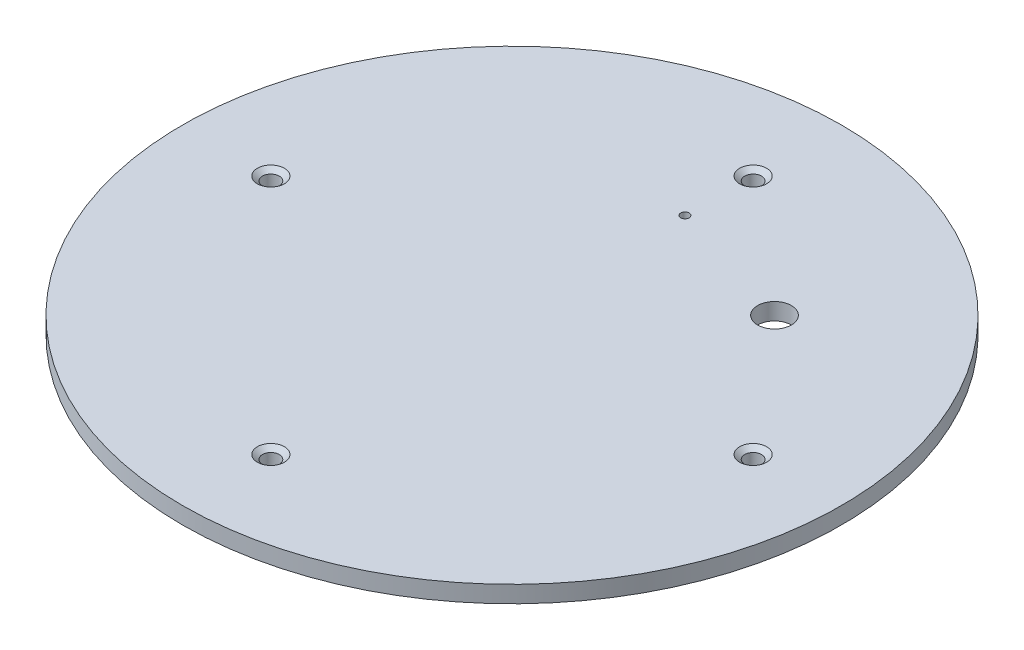
ISO-10303-21;
HEADER;
FILE_DESCRIPTION(('STEP AP214'),'2;1');
FILE_NAME('part.step','',(''),(''),'','','');
FILE_SCHEMA(('AUTOMOTIVE_DESIGN { 1 0 10303 214 1 1 1 1 }'));
ENDSEC;
DATA;
#1=APPLICATION_CONTEXT('core data for automotive mechanical design processes');
#2=APPLICATION_PROTOCOL_DEFINITION('international standard','automotive_design',2000,#1);
#3=PRODUCT_CONTEXT('',#1,'mechanical');
#4=PRODUCT('Part','Part','',(#3));
#5=PRODUCT_RELATED_PRODUCT_CATEGORY('part','',(#4));
#6=PRODUCT_DEFINITION_FORMATION('','',#4);
#7=PRODUCT_DEFINITION_CONTEXT('part definition',#1,'design');
#8=PRODUCT_DEFINITION('design','',#6,#7);
#9=PRODUCT_DEFINITION_SHAPE('','',#8);
#10=(LENGTH_UNIT() NAMED_UNIT(*) SI_UNIT(.MILLI.,.METRE.));
#11=(NAMED_UNIT(*) PLANE_ANGLE_UNIT() SI_UNIT($,.RADIAN.));
#12=(NAMED_UNIT(*) SI_UNIT($,.STERADIAN.) SOLID_ANGLE_UNIT());
#13=UNCERTAINTY_MEASURE_WITH_UNIT(LENGTH_MEASURE(1.E-05),#10,'distance_accuracy_value','');
#14=(GEOMETRIC_REPRESENTATION_CONTEXT(3) GLOBAL_UNCERTAINTY_ASSIGNED_CONTEXT((#13)) GLOBAL_UNIT_ASSIGNED_CONTEXT((#10,
#11,#12)) REPRESENTATION_CONTEXT('',''));
#15=CARTESIAN_POINT('',(0.,0.,0.));
#16=DIRECTION('',(0.,0.,1.));
#17=DIRECTION('',(1.,0.,0.));
#18=AXIS2_PLACEMENT_3D('',#15,#16,#17);
#19=CARTESIAN_POINT('',(0.,1.,0.));
#20=DIRECTION('',(0.,-1.,0.));
#21=DIRECTION('',(0.,0.,-1.));
#22=AXIS2_PLACEMENT_3D('',#19,#20,#21);
#23=CYLINDRICAL_SURFACE('',#22,19.53);
#24=CARTESIAN_POINT('',(0.,1.,0.));
#25=DIRECTION('',(0.,1.,0.));
#26=DIRECTION('',(0.,0.,1.));
#27=AXIS2_PLACEMENT_3D('',#24,#25,#26);
#28=CIRCLE('',#27,19.53);
#29=CARTESIAN_POINT('',(0.,1.,19.53));
#30=VERTEX_POINT('',#29);
#31=EDGE_CURVE('E10',#30,#30,#28,.T.);
#32=ORIENTED_EDGE('',*,*,#31,.F.);
#33=EDGE_LOOP('',(#32));
#34=FACE_BOUND('',#33,.T.);
#35=CARTESIAN_POINT('',(0.,0.,0.));
#36=DIRECTION('',(0.,1.,0.));
#37=DIRECTION('',(0.,0.,1.));
#38=AXIS2_PLACEMENT_3D('',#35,#36,#37);
#39=CIRCLE('',#38,19.53);
#40=CARTESIAN_POINT('',(0.,0.,19.53));
#41=VERTEX_POINT('',#40);
#42=EDGE_CURVE('E34',#41,#41,#39,.T.);
#43=ORIENTED_EDGE('',*,*,#42,.T.);
#44=EDGE_LOOP('',(#43));
#45=FACE_BOUND('',#44,.T.);
#46=ADVANCED_FACE('F31',(#34,#45),#23,.T.);
#47=CARTESIAN_POINT('',(0.,1.,0.));
#48=DIRECTION('',(0.,1.,0.));
#49=DIRECTION('',(0.,0.,1.));
#50=AXIS2_PLACEMENT_3D('',#47,#48,#49);
#51=PLANE('',#50);
#52=CARTESIAN_POINT('',(0.,1.,-10.25));
#53=DIRECTION('',(0.,1.,0.));
#54=DIRECTION('',(0.,0.,1.));
#55=AXIS2_PLACEMENT_3D('',#52,#53,#54);
#56=CIRCLE('',#55,0.25);
#57=CARTESIAN_POINT('',(0.,1.,-10.));
#58=VERTEX_POINT('',#57);
#59=EDGE_CURVE('E78',#58,#58,#56,.T.);
#60=ORIENTED_EDGE('',*,*,#59,.F.);
#61=EDGE_LOOP('',(#60));
#62=FACE_BOUND('',#61,.T.);
#63=CARTESIAN_POINT('',(7.77817459305201,1.,-7.77817459305204));
#64=DIRECTION('',(0.,1.,0.));
#65=DIRECTION('',(0.,0.,1.));
#66=AXIS2_PLACEMENT_3D('',#63,#64,#65);
#67=CIRCLE('',#66,1.00000000000001);
#68=CARTESIAN_POINT('',(7.77817459305201,1.,-6.77817459305202));
#69=VERTEX_POINT('',#68);
#70=EDGE_CURVE('E81',#69,#69,#67,.T.);
#71=ORIENTED_EDGE('',*,*,#70,.F.);
#72=EDGE_LOOP('',(#71));
#73=FACE_BOUND('',#72,.T.);
#74=CARTESIAN_POINT('',(0.,1.,-14.29));
#75=DIRECTION('',(0.,1.,0.));
#76=DIRECTION('',(0.,0.,1.));
#77=AXIS2_PLACEMENT_3D('',#74,#75,#76);
#78=CIRCLE('',#77,0.8);
#79=CARTESIAN_POINT('',(0.,1.,-13.49));
#80=VERTEX_POINT('',#79);
#81=EDGE_CURVE('E75',#80,#80,#78,.T.);
#82=ORIENTED_EDGE('',*,*,#81,.F.);
#83=EDGE_LOOP('',(#82));
#84=FACE_BOUND('',#83,.T.);
#85=CARTESIAN_POINT('',(14.29,1.,0.));
#86=DIRECTION('',(0.,1.,0.));
#87=DIRECTION('',(0.,0.,1.));
#88=AXIS2_PLACEMENT_3D('',#85,#86,#87);
#89=CIRCLE('',#88,0.8);
#90=CARTESIAN_POINT('',(14.29,1.,0.8));
#91=VERTEX_POINT('',#90);
#92=EDGE_CURVE('E66',#91,#91,#89,.T.);
#93=ORIENTED_EDGE('',*,*,#92,.F.);
#94=EDGE_LOOP('',(#93));
#95=FACE_BOUND('',#94,.T.);
#96=CARTESIAN_POINT('',(0.,1.,14.29));
#97=DIRECTION('',(0.,1.,0.));
#98=DIRECTION('',(0.,0.,1.));
#99=AXIS2_PLACEMENT_3D('',#96,#97,#98);
#100=CIRCLE('',#99,0.8);
#101=CARTESIAN_POINT('',(0.,1.,15.09));
#102=VERTEX_POINT('',#101);
#103=EDGE_CURVE('E57',#102,#102,#100,.T.);
#104=ORIENTED_EDGE('',*,*,#103,.F.);
#105=EDGE_LOOP('',(#104));
#106=FACE_BOUND('',#105,.T.);
#107=CARTESIAN_POINT('',(-14.29,1.,0.));
#108=DIRECTION('',(0.,1.,0.));
#109=DIRECTION('',(0.,0.,1.));
#110=AXIS2_PLACEMENT_3D('',#107,#108,#109);
#111=CIRCLE('',#110,0.8);
#112=CARTESIAN_POINT('',(-14.29,1.,0.8));
#113=VERTEX_POINT('',#112);
#114=EDGE_CURVE('E48',#113,#113,#111,.T.);
#115=ORIENTED_EDGE('',*,*,#114,.F.);
#116=EDGE_LOOP('',(#115));
#117=FACE_BOUND('',#116,.T.);
#118=ORIENTED_EDGE('',*,*,#31,.T.);
#119=EDGE_LOOP('',(#118));
#120=FACE_BOUND('',#119,.T.);
#121=ADVANCED_FACE('F106',(#62,#73,#84,#95,#106,#117,#120),#51,.T.);
#122=CARTESIAN_POINT('',(0.,0.,0.));
#123=DIRECTION('',(0.,1.,0.));
#124=DIRECTION('',(0.,0.,1.));
#125=AXIS2_PLACEMENT_3D('',#122,#123,#124);
#126=PLANE('',#125);
#127=CARTESIAN_POINT('',(0.,0.,-10.25));
#128=DIRECTION('',(0.,1.,0.));
#129=DIRECTION('',(0.,0.,1.));
#130=AXIS2_PLACEMENT_3D('',#127,#128,#129);
#131=CIRCLE('',#130,0.25);
#132=CARTESIAN_POINT('',(0.,0.,-10.));
#133=VERTEX_POINT('',#132);
#134=EDGE_CURVE('E84',#133,#133,#131,.T.);
#135=ORIENTED_EDGE('',*,*,#134,.T.);
#136=EDGE_LOOP('',(#135));
#137=FACE_BOUND('',#136,.T.);
#138=CARTESIAN_POINT('',(7.77817459305201,0.,-7.77817459305204));
#139=DIRECTION('',(0.,1.,0.));
#140=DIRECTION('',(0.,0.,1.));
#141=AXIS2_PLACEMENT_3D('',#138,#139,#140);
#142=CIRCLE('',#141,1.00000000000001);
#143=CARTESIAN_POINT('',(7.77817459305201,0.,-6.77817459305202));
#144=VERTEX_POINT('',#143);
#145=EDGE_CURVE('E85',#144,#144,#142,.T.);
#146=ORIENTED_EDGE('',*,*,#145,.T.);
#147=EDGE_LOOP('',(#146));
#148=FACE_BOUND('',#147,.T.);
#149=CARTESIAN_POINT('',(0.,0.,-14.29));
#150=DIRECTION('',(0.,1.,0.));
#151=DIRECTION('',(0.,0.,1.));
#152=AXIS2_PLACEMENT_3D('',#149,#150,#151);
#153=CIRCLE('',#152,0.499999999999988);
#154=CARTESIAN_POINT('',(0.,0.,-13.79));
#155=VERTEX_POINT('',#154);
#156=EDGE_CURVE('E69',#155,#155,#153,.T.);
#157=ORIENTED_EDGE('',*,*,#156,.T.);
#158=EDGE_LOOP('',(#157));
#159=FACE_BOUND('',#158,.T.);
#160=CARTESIAN_POINT('',(14.29,0.,0.));
#161=DIRECTION('',(0.,1.,0.));
#162=DIRECTION('',(0.,0.,1.));
#163=AXIS2_PLACEMENT_3D('',#160,#161,#162);
#164=CIRCLE('',#163,0.499999999999988);
#165=CARTESIAN_POINT('',(14.29,0.,0.499999999999988));
#166=VERTEX_POINT('',#165);
#167=EDGE_CURVE('E60',#166,#166,#164,.T.);
#168=ORIENTED_EDGE('',*,*,#167,.T.);
#169=EDGE_LOOP('',(#168));
#170=FACE_BOUND('',#169,.T.);
#171=CARTESIAN_POINT('',(0.,0.,14.29));
#172=DIRECTION('',(0.,1.,0.));
#173=DIRECTION('',(0.,0.,1.));
#174=AXIS2_PLACEMENT_3D('',#171,#172,#173);
#175=CIRCLE('',#174,0.499999999999988);
#176=CARTESIAN_POINT('',(0.,0.,14.79));
#177=VERTEX_POINT('',#176);
#178=EDGE_CURVE('E51',#177,#177,#175,.T.);
#179=ORIENTED_EDGE('',*,*,#178,.T.);
#180=EDGE_LOOP('',(#179));
#181=FACE_BOUND('',#180,.T.);
#182=CARTESIAN_POINT('',(-14.29,0.,0.));
#183=DIRECTION('',(0.,1.,0.));
#184=DIRECTION('',(0.,0.,1.));
#185=AXIS2_PLACEMENT_3D('',#182,#183,#184);
#186=CIRCLE('',#185,0.499999999999988);
#187=CARTESIAN_POINT('',(-14.29,0.,0.499999999999988));
#188=VERTEX_POINT('',#187);
#189=EDGE_CURVE('E41',#188,#188,#186,.T.);
#190=ORIENTED_EDGE('',*,*,#189,.T.);
#191=EDGE_LOOP('',(#190));
#192=FACE_BOUND('',#191,.T.);
#193=ORIENTED_EDGE('',*,*,#42,.F.);
#194=EDGE_LOOP('',(#193));
#195=FACE_BOUND('',#194,.T.);
#196=ADVANCED_FACE('F91',(#137,#148,#159,#170,#181,#192,#195),#126,.F.);
#197=CARTESIAN_POINT('',(-14.29,1.,0.));
#198=DIRECTION('',(0.,1.,0.));
#199=DIRECTION('',(0.,0.,1.));
#200=AXIS2_PLACEMENT_3D('',#197,#198,#199);
#201=CYLINDRICAL_SURFACE('',#200,0.499999999999994);
#202=ORIENTED_EDGE('',*,*,#189,.F.);
#203=EDGE_LOOP('',(#202));
#204=FACE_BOUND('',#203,.T.);
#205=CARTESIAN_POINT('',(-14.29,0.748270110646816,0.));
#206=DIRECTION('',(0.,1.,0.));
#207=DIRECTION('',(0.,0.,1.));
#208=AXIS2_PLACEMENT_3D('',#205,#206,#207);
#209=CIRCLE('',#208,0.5);
#210=CARTESIAN_POINT('',(-14.29,0.748270110646816,0.5));
#211=VERTEX_POINT('',#210);
#212=EDGE_CURVE('E45',#211,#211,#209,.T.);
#213=ORIENTED_EDGE('',*,*,#212,.T.);
#214=EDGE_LOOP('',(#213));
#215=FACE_BOUND('',#214,.T.);
#216=ADVANCED_FACE('F117',(#204,#215),#201,.F.);
#217=CARTESIAN_POINT('',(-14.29,1.,0.));
#218=DIRECTION('',(0.,1.,0.));
#219=DIRECTION('',(0.,0.,1.));
#220=AXIS2_PLACEMENT_3D('',#217,#218,#219);
#221=CONICAL_SURFACE('',#220,0.8,0.872664625997164);
#222=ORIENTED_EDGE('',*,*,#212,.F.);
#223=EDGE_LOOP('',(#222));
#224=FACE_BOUND('',#223,.T.);
#225=ORIENTED_EDGE('',*,*,#114,.T.);
#226=EDGE_LOOP('',(#225));
#227=FACE_BOUND('',#226,.T.);
#228=ADVANCED_FACE('F121',(#224,#227),#221,.F.);
#229=CARTESIAN_POINT('',(0.,1.,14.29));
#230=DIRECTION('',(0.,1.,0.));
#231=DIRECTION('',(0.,0.,1.));
#232=AXIS2_PLACEMENT_3D('',#229,#230,#231);
#233=CYLINDRICAL_SURFACE('',#232,0.499999999999994);
#234=ORIENTED_EDGE('',*,*,#178,.F.);
#235=EDGE_LOOP('',(#234));
#236=FACE_BOUND('',#235,.T.);
#237=CARTESIAN_POINT('',(0.,0.748270110646816,14.29));
#238=DIRECTION('',(0.,1.,0.));
#239=DIRECTION('',(0.,0.,1.));
#240=AXIS2_PLACEMENT_3D('',#237,#238,#239);
#241=CIRCLE('',#240,0.5);
#242=CARTESIAN_POINT('',(0.,0.748270110646816,14.79));
#243=VERTEX_POINT('',#242);
#244=EDGE_CURVE('E54',#243,#243,#241,.T.);
#245=ORIENTED_EDGE('',*,*,#244,.T.);
#246=EDGE_LOOP('',(#245));
#247=FACE_BOUND('',#246,.T.);
#248=ADVANCED_FACE('F127',(#236,#247),#233,.F.);
#249=CARTESIAN_POINT('',(0.,1.,14.29));
#250=DIRECTION('',(0.,1.,0.));
#251=DIRECTION('',(0.,0.,1.));
#252=AXIS2_PLACEMENT_3D('',#249,#250,#251);
#253=CONICAL_SURFACE('',#252,0.8,0.872664625997164);
#254=ORIENTED_EDGE('',*,*,#244,.F.);
#255=EDGE_LOOP('',(#254));
#256=FACE_BOUND('',#255,.T.);
#257=ORIENTED_EDGE('',*,*,#103,.T.);
#258=EDGE_LOOP('',(#257));
#259=FACE_BOUND('',#258,.T.);
#260=ADVANCED_FACE('F131',(#256,#259),#253,.F.);
#261=CARTESIAN_POINT('',(14.29,1.,0.));
#262=DIRECTION('',(0.,1.,0.));
#263=DIRECTION('',(0.,0.,1.));
#264=AXIS2_PLACEMENT_3D('',#261,#262,#263);
#265=CYLINDRICAL_SURFACE('',#264,0.499999999999994);
#266=ORIENTED_EDGE('',*,*,#167,.F.);
#267=EDGE_LOOP('',(#266));
#268=FACE_BOUND('',#267,.T.);
#269=CARTESIAN_POINT('',(14.29,0.748270110646816,0.));
#270=DIRECTION('',(0.,1.,0.));
#271=DIRECTION('',(0.,0.,1.));
#272=AXIS2_PLACEMENT_3D('',#269,#270,#271);
#273=CIRCLE('',#272,0.5);
#274=CARTESIAN_POINT('',(14.29,0.748270110646816,0.5));
#275=VERTEX_POINT('',#274);
#276=EDGE_CURVE('E63',#275,#275,#273,.T.);
#277=ORIENTED_EDGE('',*,*,#276,.T.);
#278=EDGE_LOOP('',(#277));
#279=FACE_BOUND('',#278,.T.);
#280=ADVANCED_FACE('F135',(#268,#279),#265,.F.);
#281=CARTESIAN_POINT('',(14.29,1.,0.));
#282=DIRECTION('',(0.,1.,0.));
#283=DIRECTION('',(0.,0.,1.));
#284=AXIS2_PLACEMENT_3D('',#281,#282,#283);
#285=CONICAL_SURFACE('',#284,0.8,0.872664625997164);
#286=ORIENTED_EDGE('',*,*,#276,.F.);
#287=EDGE_LOOP('',(#286));
#288=FACE_BOUND('',#287,.T.);
#289=ORIENTED_EDGE('',*,*,#92,.T.);
#290=EDGE_LOOP('',(#289));
#291=FACE_BOUND('',#290,.T.);
#292=ADVANCED_FACE('F139',(#288,#291),#285,.F.);
#293=CARTESIAN_POINT('',(0.,1.,-14.29));
#294=DIRECTION('',(0.,1.,0.));
#295=DIRECTION('',(0.,0.,1.));
#296=AXIS2_PLACEMENT_3D('',#293,#294,#295);
#297=CYLINDRICAL_SURFACE('',#296,0.499999999999994);
#298=ORIENTED_EDGE('',*,*,#156,.F.);
#299=EDGE_LOOP('',(#298));
#300=FACE_BOUND('',#299,.T.);
#301=CARTESIAN_POINT('',(0.,0.748270110646816,-14.29));
#302=DIRECTION('',(0.,1.,0.));
#303=DIRECTION('',(0.,0.,1.));
#304=AXIS2_PLACEMENT_3D('',#301,#302,#303);
#305=CIRCLE('',#304,0.5);
#306=CARTESIAN_POINT('',(0.,0.748270110646816,-13.79));
#307=VERTEX_POINT('',#306);
#308=EDGE_CURVE('E72',#307,#307,#305,.T.);
#309=ORIENTED_EDGE('',*,*,#308,.T.);
#310=EDGE_LOOP('',(#309));
#311=FACE_BOUND('',#310,.T.);
#312=ADVANCED_FACE('F143',(#300,#311),#297,.F.);
#313=CARTESIAN_POINT('',(0.,1.,-14.29));
#314=DIRECTION('',(0.,1.,0.));
#315=DIRECTION('',(0.,0.,1.));
#316=AXIS2_PLACEMENT_3D('',#313,#314,#315);
#317=CONICAL_SURFACE('',#316,0.8,0.872664625997164);
#318=ORIENTED_EDGE('',*,*,#308,.F.);
#319=EDGE_LOOP('',(#318));
#320=FACE_BOUND('',#319,.T.);
#321=ORIENTED_EDGE('',*,*,#81,.T.);
#322=EDGE_LOOP('',(#321));
#323=FACE_BOUND('',#322,.T.);
#324=ADVANCED_FACE('F102',(#320,#323),#317,.F.);
#325=CARTESIAN_POINT('',(7.77817459305201,0.,-7.77817459305204));
#326=DIRECTION('',(0.,1.,0.));
#327=DIRECTION('',(0.,0.,1.));
#328=AXIS2_PLACEMENT_3D('',#325,#326,#327);
#329=CYLINDRICAL_SURFACE('',#328,1.00000000000001);
#330=ORIENTED_EDGE('',*,*,#70,.T.);
#331=EDGE_LOOP('',(#330));
#332=FACE_BOUND('',#331,.T.);
#333=ORIENTED_EDGE('',*,*,#145,.F.);
#334=EDGE_LOOP('',(#333));
#335=FACE_BOUND('',#334,.T.);
#336=ADVANCED_FACE('F96',(#332,#335),#329,.F.);
#337=CARTESIAN_POINT('',(0.,0.,-10.25));
#338=DIRECTION('',(0.,1.,0.));
#339=DIRECTION('',(0.,0.,1.));
#340=AXIS2_PLACEMENT_3D('',#337,#338,#339);
#341=CYLINDRICAL_SURFACE('',#340,0.25);
#342=ORIENTED_EDGE('',*,*,#59,.T.);
#343=EDGE_LOOP('',(#342));
#344=FACE_BOUND('',#343,.T.);
#345=ORIENTED_EDGE('',*,*,#134,.F.);
#346=EDGE_LOOP('',(#345));
#347=FACE_BOUND('',#346,.T.);
#348=ADVANCED_FACE('F94',(#344,#347),#341,.F.);
#349=CLOSED_SHELL('',(#46,#121,#196,#216,#228,#248,#260,#280,#292,#312,#324,#336,#348));
#350=MANIFOLD_SOLID_BREP('B2',#349);
#351=ADVANCED_BREP_SHAPE_REPRESENTATION('',(#18,#350),#14);
#352=SHAPE_DEFINITION_REPRESENTATION(#9,#351);
ENDSEC;
END-ISO-10303-21;
